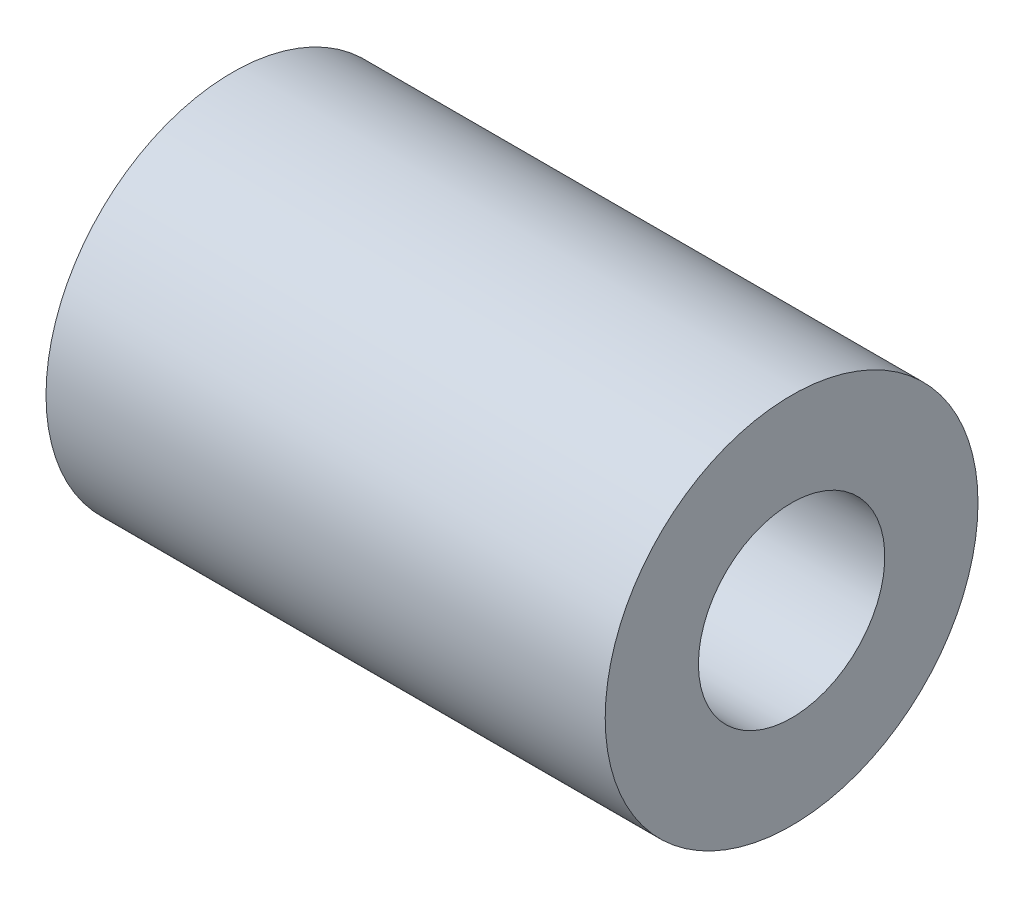
ISO-10303-21;
HEADER;
FILE_DESCRIPTION(('STEP AP214'),'2;1');
FILE_NAME('part.step','',(''),(''),'','','');
FILE_SCHEMA(('AUTOMOTIVE_DESIGN { 1 0 10303 214 1 1 1 1 }'));
ENDSEC;
DATA;
#1=APPLICATION_CONTEXT('core data for automotive mechanical design processes');
#2=APPLICATION_PROTOCOL_DEFINITION('international standard','automotive_design',2000,#1);
#3=PRODUCT_CONTEXT('',#1,'mechanical');
#4=PRODUCT('Part','Part','',(#3));
#5=PRODUCT_RELATED_PRODUCT_CATEGORY('part','',(#4));
#6=PRODUCT_DEFINITION_FORMATION('','',#4);
#7=PRODUCT_DEFINITION_CONTEXT('part definition',#1,'design');
#8=PRODUCT_DEFINITION('design','',#6,#7);
#9=PRODUCT_DEFINITION_SHAPE('','',#8);
#10=(LENGTH_UNIT() NAMED_UNIT(*) SI_UNIT(.MILLI.,.METRE.));
#11=(NAMED_UNIT(*) PLANE_ANGLE_UNIT() SI_UNIT($,.RADIAN.));
#12=(NAMED_UNIT(*) SI_UNIT($,.STERADIAN.) SOLID_ANGLE_UNIT());
#13=UNCERTAINTY_MEASURE_WITH_UNIT(LENGTH_MEASURE(1.E-05),#10,'distance_accuracy_value','');
#14=(GEOMETRIC_REPRESENTATION_CONTEXT(3) GLOBAL_UNCERTAINTY_ASSIGNED_CONTEXT((#13)) GLOBAL_UNIT_ASSIGNED_CONTEXT((#10,
#11,#12)) REPRESENTATION_CONTEXT('',''));
#15=CARTESIAN_POINT('',(0.,0.,0.));
#16=DIRECTION('',(0.,0.,1.));
#17=DIRECTION('',(1.,0.,0.));
#18=AXIS2_PLACEMENT_3D('',#15,#16,#17);
#19=CARTESIAN_POINT('',(4.7625,0.,0.));
#20=DIRECTION('',(1.,0.,0.));
#21=DIRECTION('',(0.,0.,-1.));
#22=AXIS2_PLACEMENT_3D('',#19,#20,#21);
#23=PLANE('',#22);
#24=CARTESIAN_POINT('',(4.7625,0.,0.));
#25=DIRECTION('',(1.,0.,0.));
#26=DIRECTION('',(0.,0.,-1.));
#27=AXIS2_PLACEMENT_3D('',#24,#25,#26);
#28=CIRCLE('',#27,3.175);
#29=CARTESIAN_POINT('',(4.7625,0.,3.175));
#30=VERTEX_POINT('',#29);
#31=EDGE_CURVE('E10',#30,#30,#28,.T.);
#32=ORIENTED_EDGE('',*,*,#31,.T.);
#33=EDGE_LOOP('',(#32));
#34=FACE_BOUND('',#33,.T.);
#35=CARTESIAN_POINT('',(4.7625,0.,0.));
#36=DIRECTION('',(1.,0.,0.));
#37=DIRECTION('',(0.,0.,-1.));
#38=AXIS2_PLACEMENT_3D('',#35,#36,#37);
#39=CIRCLE('',#38,1.5875);
#40=CARTESIAN_POINT('',(4.7625,0.,1.5875));
#41=VERTEX_POINT('',#40);
#42=EDGE_CURVE('E381',#41,#41,#39,.T.);
#43=ORIENTED_EDGE('',*,*,#42,.F.);
#44=EDGE_LOOP('',(#43));
#45=FACE_BOUND('',#44,.T.);
#46=ADVANCED_FACE('F370',(#34,#45),#23,.T.);
#47=CARTESIAN_POINT('',(-4.7625,0.,0.));
#48=DIRECTION('',(1.,0.,0.));
#49=DIRECTION('',(0.,0.,-1.));
#50=AXIS2_PLACEMENT_3D('',#47,#48,#49);
#51=PLANE('',#50);
#52=CARTESIAN_POINT('',(-4.7625,0.,0.));
#53=DIRECTION('',(1.,0.,0.));
#54=DIRECTION('',(0.,0.,-1.));
#55=AXIS2_PLACEMENT_3D('',#52,#53,#54);
#56=CIRCLE('',#55,3.175);
#57=CARTESIAN_POINT('',(-4.7625,0.,3.175));
#58=VERTEX_POINT('',#57);
#59=EDGE_CURVE('E377',#58,#58,#56,.T.);
#60=ORIENTED_EDGE('',*,*,#59,.F.);
#61=EDGE_LOOP('',(#60));
#62=FACE_BOUND('',#61,.T.);
#63=CARTESIAN_POINT('',(-4.7625,0.,0.));
#64=DIRECTION('',(1.,0.,0.));
#65=DIRECTION('',(0.,0.,-1.));
#66=AXIS2_PLACEMENT_3D('',#63,#64,#65);
#67=CIRCLE('',#66,1.5875);
#68=CARTESIAN_POINT('',(-4.7625,0.,1.5875));
#69=VERTEX_POINT('',#68);
#70=EDGE_CURVE('E385',#69,#69,#67,.T.);
#71=ORIENTED_EDGE('',*,*,#70,.T.);
#72=EDGE_LOOP('',(#71));
#73=FACE_BOUND('',#72,.T.);
#74=ADVANCED_FACE('F391',(#62,#73),#51,.F.);
#75=CARTESIAN_POINT('',(4.7625,0.,0.));
#76=DIRECTION('',(-1.,0.,0.));
#77=DIRECTION('',(0.,0.,1.));
#78=AXIS2_PLACEMENT_3D('',#75,#76,#77);
#79=CYLINDRICAL_SURFACE('',#78,3.175);
#80=CARTESIAN_POINT('',(4.7625,0.,3.175));
#81=CARTESIAN_POINT('',(4.66328125,0.,3.175));
#82=CARTESIAN_POINT('',(4.5640625,0.,3.175));
#83=CARTESIAN_POINT('',(4.365625,0.,3.175));
#84=CARTESIAN_POINT('',(4.26640625,0.,3.175));
#85=CARTESIAN_POINT('',(4.06796875,0.,3.175));
#86=CARTESIAN_POINT('',(3.96875,0.,3.175));
#87=CARTESIAN_POINT('',(3.7703125,0.,3.175));
#88=CARTESIAN_POINT('',(3.67109375,0.,3.175));
#89=CARTESIAN_POINT('',(3.47265625,0.,3.175));
#90=CARTESIAN_POINT('',(3.3734375,0.,3.175));
#91=CARTESIAN_POINT('',(3.175,0.,3.175));
#92=CARTESIAN_POINT('',(3.07578125,0.,3.175));
#93=CARTESIAN_POINT('',(2.87734375,0.,3.175));
#94=CARTESIAN_POINT('',(2.778125,0.,3.175));
#95=CARTESIAN_POINT('',(2.5796875,0.,3.175));
#96=CARTESIAN_POINT('',(2.48046875,0.,3.175));
#97=CARTESIAN_POINT('',(2.28203125,0.,3.175));
#98=CARTESIAN_POINT('',(2.1828125,0.,3.175));
#99=CARTESIAN_POINT('',(1.984375,0.,3.175));
#100=CARTESIAN_POINT('',(1.88515625,0.,3.175));
#101=CARTESIAN_POINT('',(1.68671875,0.,3.175));
#102=CARTESIAN_POINT('',(1.5875,0.,3.175));
#103=CARTESIAN_POINT('',(1.3890625,0.,3.175));
#104=CARTESIAN_POINT('',(1.28984375,0.,3.175));
#105=CARTESIAN_POINT('',(1.09140625,0.,3.175));
#106=CARTESIAN_POINT('',(0.992187499999999,0.,3.175));
#107=CARTESIAN_POINT('',(0.79375,0.,3.175));
#108=CARTESIAN_POINT('',(0.69453125,0.,3.175));
#109=CARTESIAN_POINT('',(0.49609375,0.,3.175));
#110=CARTESIAN_POINT('',(0.396875,0.,3.175));
#111=CARTESIAN_POINT('',(0.1984375,0.,3.175));
#112=CARTESIAN_POINT('',(0.0992187500000001,0.,3.175));
#113=CARTESIAN_POINT('',(-0.0992187500000001,0.,3.175));
#114=CARTESIAN_POINT('',(-0.1984375,0.,3.175));
#115=CARTESIAN_POINT('',(-0.396875,0.,3.175));
#116=CARTESIAN_POINT('',(-0.49609375,0.,3.175));
#117=CARTESIAN_POINT('',(-0.69453125,0.,3.175));
#118=CARTESIAN_POINT('',(-0.793750000000001,0.,3.175));
#119=CARTESIAN_POINT('',(-0.992187500000001,0.,3.175));
#120=CARTESIAN_POINT('',(-1.09140625,0.,3.175));
#121=CARTESIAN_POINT('',(-1.28984375,0.,3.175));
#122=CARTESIAN_POINT('',(-1.3890625,0.,3.175));
#123=CARTESIAN_POINT('',(-1.5875,0.,3.175));
#124=CARTESIAN_POINT('',(-1.68671875,0.,3.175));
#125=CARTESIAN_POINT('',(-1.88515625,0.,3.175));
#126=CARTESIAN_POINT('',(-1.984375,0.,3.175));
#127=CARTESIAN_POINT('',(-2.1828125,0.,3.175));
#128=CARTESIAN_POINT('',(-2.28203125,0.,3.175));
#129=CARTESIAN_POINT('',(-2.48046875,0.,3.175));
#130=CARTESIAN_POINT('',(-2.5796875,0.,3.175));
#131=CARTESIAN_POINT('',(-2.778125,0.,3.175));
#132=CARTESIAN_POINT('',(-2.87734375,0.,3.175));
#133=CARTESIAN_POINT('',(-3.07578125,0.,3.175));
#134=CARTESIAN_POINT('',(-3.175,0.,3.175));
#135=CARTESIAN_POINT('',(-3.3734375,0.,3.175));
#136=CARTESIAN_POINT('',(-3.47265625,0.,3.175));
#137=CARTESIAN_POINT('',(-3.67109375,0.,3.175));
#138=CARTESIAN_POINT('',(-3.7703125,0.,3.175));
#139=CARTESIAN_POINT('',(-3.96875,0.,3.175));
#140=CARTESIAN_POINT('',(-4.06796875,0.,3.175));
#141=CARTESIAN_POINT('',(-4.26640625,0.,3.175));
#142=CARTESIAN_POINT('',(-4.365625,0.,3.175));
#143=CARTESIAN_POINT('',(-4.5640625,0.,3.175));
#144=CARTESIAN_POINT('',(-4.66328125,0.,3.175));
#145=CARTESIAN_POINT('',(-4.7625,0.,3.175));
#146=B_SPLINE_CURVE_WITH_KNOTS('',3,(#80,#81,#82,#83,#84,#85,#86,#87,#88,#89,#90,#91,#92,#93,
#94,#95,#96,#97,#98,#99,#100,#101,#102,#103,#104,#105,#106,#107,#108,#109,#110,#111,#112,#113,
#114,#115,#116,#117,#118,#119,#120,#121,#122,#123,#124,#125,#126,#127,#128,#129,#130,#131,#132,
#133,#134,#135,#136,#137,#138,#139,#140,#141,#142,#143,#144,#145),.UNSPECIFIED.,.F.,.F.,(4,2,2,
2,2,2,2,2,2,2,2,2,2,2,2,2,2,2,2,2,2,2,2,2,2,2,2,2,2,2,2,2,4),(0.,0.29765625,0.5953125,
0.892968750000001,1.190625,1.48828125,1.7859375,2.08359375,2.38125,2.67890625,2.9765625,
3.27421875,3.571875,3.86953125,4.1671875,4.46484375,4.7625,5.06015625,5.3578125,5.65546875,
5.953125,6.25078125,6.5484375,6.84609375,7.14375,7.44140625,7.7390625,8.03671875,8.334375,
8.63203125,8.9296875,9.22734375,9.525),.UNSPECIFIED.);
#147=EDGE_CURVE('BSEAM372',#30,#58,#146,.T.);
#148=ORIENTED_EDGE('',*,*,#31,.F.);
#149=ORIENTED_EDGE('',*,*,#59,.T.);
#150=ORIENTED_EDGE('',*,*,#147,.T.);
#151=ORIENTED_EDGE('',*,*,#147,.F.);
#152=EDGE_LOOP('',(#148,#150,#149,#151));
#153=FACE_BOUND('',#152,.T.);
#154=ADVANCED_FACE('F372',(#153),#79,.T.);
#155=CARTESIAN_POINT('',(4.7625,0.,0.));
#156=DIRECTION('',(-1.,0.,0.));
#157=DIRECTION('',(0.,0.,1.));
#158=AXIS2_PLACEMENT_3D('',#155,#156,#157);
#159=CYLINDRICAL_SURFACE('',#158,1.5875);
#160=CARTESIAN_POINT('',(4.7625,0.,1.5875));
#161=CARTESIAN_POINT('',(4.66328125,0.,1.5875));
#162=CARTESIAN_POINT('',(4.5640625,0.,1.5875));
#163=CARTESIAN_POINT('',(4.365625,0.,1.5875));
#164=CARTESIAN_POINT('',(4.26640625,0.,1.5875));
#165=CARTESIAN_POINT('',(4.06796875,0.,1.5875));
#166=CARTESIAN_POINT('',(3.96875,0.,1.5875));
#167=CARTESIAN_POINT('',(3.7703125,0.,1.5875));
#168=CARTESIAN_POINT('',(3.67109375,0.,1.5875));
#169=CARTESIAN_POINT('',(3.47265625,0.,1.5875));
#170=CARTESIAN_POINT('',(3.3734375,0.,1.5875));
#171=CARTESIAN_POINT('',(3.175,0.,1.5875));
#172=CARTESIAN_POINT('',(3.07578125,0.,1.5875));
#173=CARTESIAN_POINT('',(2.87734375,0.,1.5875));
#174=CARTESIAN_POINT('',(2.778125,0.,1.5875));
#175=CARTESIAN_POINT('',(2.5796875,0.,1.5875));
#176=CARTESIAN_POINT('',(2.48046875,0.,1.5875));
#177=CARTESIAN_POINT('',(2.28203125,0.,1.5875));
#178=CARTESIAN_POINT('',(2.1828125,0.,1.5875));
#179=CARTESIAN_POINT('',(1.984375,0.,1.5875));
#180=CARTESIAN_POINT('',(1.88515625,0.,1.5875));
#181=CARTESIAN_POINT('',(1.68671875,0.,1.5875));
#182=CARTESIAN_POINT('',(1.5875,0.,1.5875));
#183=CARTESIAN_POINT('',(1.3890625,0.,1.5875));
#184=CARTESIAN_POINT('',(1.28984375,0.,1.5875));
#185=CARTESIAN_POINT('',(1.09140625,0.,1.5875));
#186=CARTESIAN_POINT('',(0.992187499999999,0.,1.5875));
#187=CARTESIAN_POINT('',(0.793749999999999,0.,1.5875));
#188=CARTESIAN_POINT('',(0.694531249999999,0.,1.5875));
#189=CARTESIAN_POINT('',(0.496093749999999,0.,1.5875));
#190=CARTESIAN_POINT('',(0.396874999999999,0.,1.5875));
#191=CARTESIAN_POINT('',(0.198437499999999,0.,1.5875));
#192=CARTESIAN_POINT('',(0.0992187499999992,0.,1.5875));
#193=CARTESIAN_POINT('',(-0.0992187500000009,0.,1.5875));
#194=CARTESIAN_POINT('',(-0.198437500000001,0.,1.5875));
#195=CARTESIAN_POINT('',(-0.396875000000001,0.,1.5875));
#196=CARTESIAN_POINT('',(-0.496093750000001,0.,1.5875));
#197=CARTESIAN_POINT('',(-0.694531250000001,0.,1.5875));
#198=CARTESIAN_POINT('',(-0.793750000000001,0.,1.5875));
#199=CARTESIAN_POINT('',(-0.992187500000002,0.,1.5875));
#200=CARTESIAN_POINT('',(-1.09140625,0.,1.5875));
#201=CARTESIAN_POINT('',(-1.28984375,0.,1.5875));
#202=CARTESIAN_POINT('',(-1.3890625,0.,1.5875));
#203=CARTESIAN_POINT('',(-1.5875,0.,1.5875));
#204=CARTESIAN_POINT('',(-1.68671875,0.,1.5875));
#205=CARTESIAN_POINT('',(-1.88515625,0.,1.5875));
#206=CARTESIAN_POINT('',(-1.984375,0.,1.5875));
#207=CARTESIAN_POINT('',(-2.1828125,0.,1.5875));
#208=CARTESIAN_POINT('',(-2.28203125,0.,1.5875));
#209=CARTESIAN_POINT('',(-2.48046875,0.,1.5875));
#210=CARTESIAN_POINT('',(-2.5796875,0.,1.5875));
#211=CARTESIAN_POINT('',(-2.778125,0.,1.5875));
#212=CARTESIAN_POINT('',(-2.87734375,0.,1.5875));
#213=CARTESIAN_POINT('',(-3.07578125,0.,1.5875));
#214=CARTESIAN_POINT('',(-3.175,0.,1.5875));
#215=CARTESIAN_POINT('',(-3.3734375,0.,1.5875));
#216=CARTESIAN_POINT('',(-3.47265625,0.,1.5875));
#217=CARTESIAN_POINT('',(-3.67109375,0.,1.5875));
#218=CARTESIAN_POINT('',(-3.7703125,0.,1.5875));
#219=CARTESIAN_POINT('',(-3.96875,0.,1.5875));
#220=CARTESIAN_POINT('',(-4.06796875,0.,1.5875));
#221=CARTESIAN_POINT('',(-4.26640625,0.,1.5875));
#222=CARTESIAN_POINT('',(-4.365625,0.,1.5875));
#223=CARTESIAN_POINT('',(-4.5640625,0.,1.5875));
#224=CARTESIAN_POINT('',(-4.66328125,0.,1.5875));
#225=CARTESIAN_POINT('',(-4.7625,0.,1.5875));
#226=B_SPLINE_CURVE_WITH_KNOTS('',3,(#160,#161,#162,#163,#164,#165,#166,#167,#168,#169,#170,
#171,#172,#173,#174,#175,#176,#177,#178,#179,#180,#181,#182,#183,#184,#185,#186,#187,#188,#189,
#190,#191,#192,#193,#194,#195,#196,#197,#198,#199,#200,#201,#202,#203,#204,#205,#206,#207,#208,
#209,#210,#211,#212,#213,#214,#215,#216,#217,#218,#219,#220,#221,#222,#223,#224,#225),
.UNSPECIFIED.,.F.,.F.,(4,2,2,2,2,2,2,2,2,2,2,2,2,2,2,2,2,2,2,2,2,2,2,2,2,2,2,2,2,2,2,2,4),(0.,
0.297656249999999,0.595312499999999,0.89296875,1.190625,1.48828125,1.7859375,2.08359375,2.38125,
2.67890625,2.9765625,3.27421875,3.571875,3.86953125,4.1671875,4.46484375,4.7625,5.06015625,
5.3578125,5.65546875,5.953125,6.25078125,6.5484375,6.84609375,7.14375,7.44140625,7.7390625,
8.03671875,8.334375,8.63203125,8.9296875,9.22734375,9.525),.UNSPECIFIED.);
#227=EDGE_CURVE('BSEAM393',#41,#69,#226,.T.);
#228=ORIENTED_EDGE('',*,*,#42,.T.);
#229=ORIENTED_EDGE('',*,*,#70,.F.);
#230=ORIENTED_EDGE('',*,*,#227,.T.);
#231=ORIENTED_EDGE('',*,*,#227,.F.);
#232=EDGE_LOOP('',(#228,#230,#229,#231));
#233=FACE_BOUND('',#232,.T.);
#234=ADVANCED_FACE('F393',(#233),#159,.F.);
#235=CLOSED_SHELL('',(#46,#74,#154,#234));
#236=MANIFOLD_SOLID_BREP('B2',#235);
#237=ADVANCED_BREP_SHAPE_REPRESENTATION('',(#18,#236),#14);
#238=SHAPE_DEFINITION_REPRESENTATION(#9,#237);
ENDSEC;
END-ISO-10303-21;
